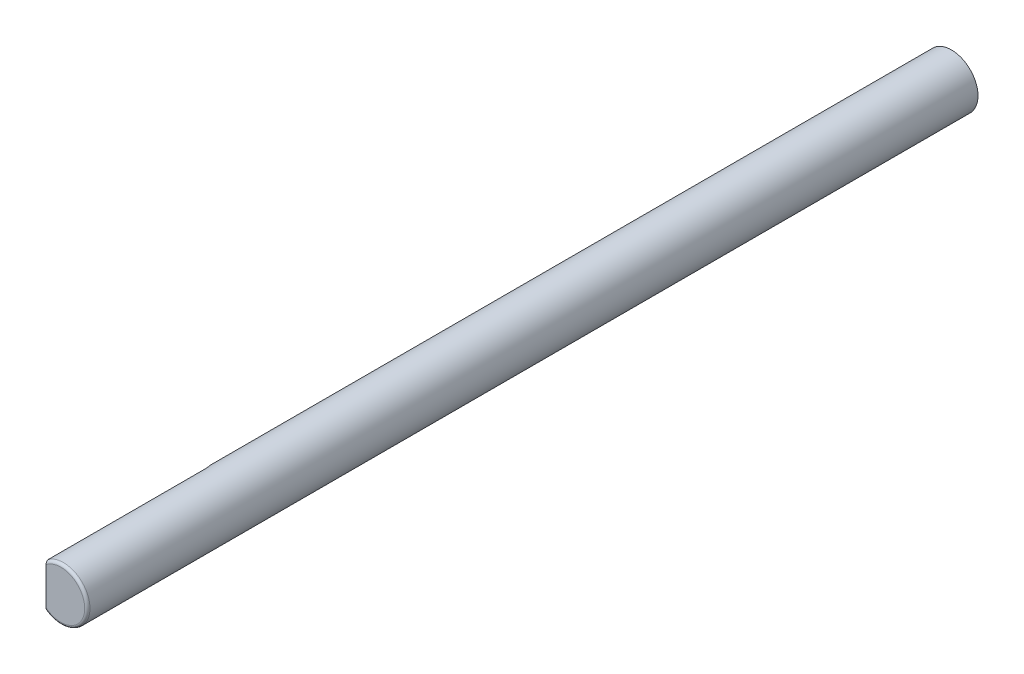
ISO-10303-21;
HEADER;
FILE_DESCRIPTION(('STEP AP214'),'2;1');
FILE_NAME('part.step','',(''),(''),'','','');
FILE_SCHEMA(('AUTOMOTIVE_DESIGN { 1 0 10303 214 1 1 1 1 }'));
ENDSEC;
DATA;
#1=APPLICATION_CONTEXT('core data for automotive mechanical design processes');
#2=APPLICATION_PROTOCOL_DEFINITION('international standard','automotive_design',2000,#1);
#3=PRODUCT_CONTEXT('',#1,'mechanical');
#4=PRODUCT('Part','Part','',(#3));
#5=PRODUCT_RELATED_PRODUCT_CATEGORY('part','',(#4));
#6=PRODUCT_DEFINITION_FORMATION('','',#4);
#7=PRODUCT_DEFINITION_CONTEXT('part definition',#1,'design');
#8=PRODUCT_DEFINITION('design','',#6,#7);
#9=PRODUCT_DEFINITION_SHAPE('','',#8);
#10=(LENGTH_UNIT() NAMED_UNIT(*) SI_UNIT(.MILLI.,.METRE.));
#11=(NAMED_UNIT(*) PLANE_ANGLE_UNIT() SI_UNIT($,.RADIAN.));
#12=(NAMED_UNIT(*) SI_UNIT($,.STERADIAN.) SOLID_ANGLE_UNIT());
#13=UNCERTAINTY_MEASURE_WITH_UNIT(LENGTH_MEASURE(1.E-05),#10,'distance_accuracy_value','');
#14=(GEOMETRIC_REPRESENTATION_CONTEXT(3) GLOBAL_UNCERTAINTY_ASSIGNED_CONTEXT((#13)) GLOBAL_UNIT_ASSIGNED_CONTEXT((#10,
#11,#12)) REPRESENTATION_CONTEXT('',''));
#15=CARTESIAN_POINT('',(0.,0.,0.));
#16=DIRECTION('',(0.,0.,1.));
#17=DIRECTION('',(1.,0.,0.));
#18=AXIS2_PLACEMENT_3D('',#15,#16,#17);
#19=CARTESIAN_POINT('',(0.,0.,84.));
#20=DIRECTION('',(0.,0.,-1.));
#21=DIRECTION('',(-1.,0.,0.));
#22=AXIS2_PLACEMENT_3D('',#19,#20,#21);
#23=CYLINDRICAL_SURFACE('',#22,2.5);
#24=CARTESIAN_POINT('',(0.,0.,0.));
#25=DIRECTION('',(0.,0.,1.));
#26=DIRECTION('',(1.,0.,0.));
#27=AXIS2_PLACEMENT_3D('',#24,#25,#26);
#28=CIRCLE('',#27,2.5);
#29=CARTESIAN_POINT('',(2.5,0.,0.));
#30=VERTEX_POINT('',#29);
#31=EDGE_CURVE('E83',#30,#30,#28,.T.);
#32=ORIENTED_EDGE('',*,*,#31,.T.);
#33=EDGE_LOOP('',(#32));
#34=FACE_BOUND('',#33,.T.);
#35=DIRECTION('',(0.,0.,-1.));
#36=VECTOR('',#35,1.);
#37=CARTESIAN_POINT('',(-1.4,2.0712315177208,84.));
#38=LINE('',#37,#36);
#39=CARTESIAN_POINT('',(-1.4,2.07123151772333,83.750000000001));
#40=VERTEX_POINT('',#39);
#41=CARTESIAN_POINT('',(-1.4,2.0712315177208,69.));
#42=VERTEX_POINT('',#41);
#43=EDGE_CURVE('E79',#40,#42,#38,.T.);
#44=ORIENTED_EDGE('',*,*,#43,.F.);
#45=CARTESIAN_POINT('',(0.,0.,83.75));
#46=DIRECTION('',(0.,0.,1.));
#47=DIRECTION('',(1.,0.,0.));
#48=AXIS2_PLACEMENT_3D('',#45,#46,#47);
#49=CIRCLE('',#48,2.5);
#50=CARTESIAN_POINT('',(-1.4,-2.07123151776407,83.7499999999845));
#51=VERTEX_POINT('',#50);
#52=EDGE_CURVE('E82',#40,#51,#49,.F.);
#53=ORIENTED_EDGE('',*,*,#52,.T.);
#54=DIRECTION('',(0.,0.,-1.));
#55=VECTOR('',#54,1.);
#56=CARTESIAN_POINT('',(-1.4,-2.0712315177208,84.));
#57=LINE('',#56,#55);
#58=CARTESIAN_POINT('',(-1.4,-2.0712315177208,69.));
#59=VERTEX_POINT('',#58);
#60=EDGE_CURVE('E59',#59,#51,#57,.F.);
#61=ORIENTED_EDGE('',*,*,#60,.F.);
#62=CARTESIAN_POINT('',(-1.4,2.0712315177208,69.));
#63=CARTESIAN_POINT('',(-1.39999849760734,2.071230026212,68.9761336321505));
#64=CARTESIAN_POINT('',(-1.4008551488557,2.07065376805564,68.9522791906795));
#65=CARTESIAN_POINT('',(-1.40426145306465,2.06834621400237,68.9047514836602));
#66=CARTESIAN_POINT('',(-1.40681083767712,2.06661510118376,68.8810781899963));
#67=CARTESIAN_POINT('',(-1.41693911021825,2.059697650857,68.8107243778241));
#68=CARTESIAN_POINT('',(-1.42699848417546,2.052787241238,68.7645353429884));
#69=CARTESIAN_POINT('',(-1.45316462908092,2.03434628246119,68.6749057138266));
#70=CARTESIAN_POINT('',(-1.46927177576743,2.02281544624079,68.6314652904634));
#71=CARTESIAN_POINT('',(-1.50660792862268,1.99516165480954,68.5484218227556));
#72=CARTESIAN_POINT('',(-1.52783743401127,1.97903825198415,68.5088191529622));
#73=CARTESIAN_POINT('',(-1.57474464069025,1.94192906346373,68.4334600120503));
#74=CARTESIAN_POINT('',(-1.60051004822206,1.92084396604997,68.3978075175362));
#75=CARTESIAN_POINT('',(-1.65476045746045,1.8743126759908,68.3318339530109));
#76=CARTESIAN_POINT('',(-1.68324681285336,1.84886430753644,68.3015155582839));
#77=CARTESIAN_POINT('',(-1.75188020240658,1.78432861963461,68.2365263708325));
#78=CARTESIAN_POINT('',(-1.79259801470348,1.74359569054774,68.2040886147845));
#79=CARTESIAN_POINT('',(-1.87373293961664,1.6561127393503,68.1482480300484));
#80=CARTESIAN_POINT('',(-1.9141494387131,1.60935281202574,68.1248603339338));
#81=CARTESIAN_POINT('',(-2.00868395747665,1.49097224184157,68.0776682724385));
#82=CARTESIAN_POINT('',(-2.06167245566697,1.41698665412497,68.0575792205504));
#83=CARTESIAN_POINT('',(-2.15998693685785,1.26211622920362,68.0278654267815));
#84=CARTESIAN_POINT('',(-2.20529362558644,1.18121476547613,68.0182667137365));
#85=CARTESIAN_POINT('',(-2.27518682931121,1.03824044791976,68.0073850582776));
#86=CARTESIAN_POINT('',(-2.3020034371994,0.977346431713889,68.0045145279523));
#87=CARTESIAN_POINT('',(-2.35072392208405,0.853535355661817,68.0009151495136));
#88=CARTESIAN_POINT('',(-2.37262582697523,0.790617495251964,68.0001871597154));
#89=CARTESIAN_POINT('',(-2.41133776392088,0.663236816952994,67.9998771329302));
#90=CARTESIAN_POINT('',(-2.42814758959221,0.598773936558105,68.0002951423839));
#91=CARTESIAN_POINT('',(-2.45656795841086,0.468725016715089,68.0014998441395));
#92=CARTESIAN_POINT('',(-2.46817917835835,0.403139124625449,68.0022864884219));
#93=CARTESIAN_POINT('',(-2.48629500567455,0.270052532778325,68.0036879932044));
#94=CARTESIAN_POINT('',(-2.49270333079678,0.202538665641398,68.0042994849443));
#95=CARTESIAN_POINT('',(-2.50001501608926,0.0672084542153271,68.0050072591245));
#96=CARTESIAN_POINT('',(-2.50091820098299,-0.000607899635807625,68.0051035251607));
#97=CARTESIAN_POINT('',(-2.49721126667906,-0.136146726712124,68.0047344925744));
#98=CARTESIAN_POINT('',(-2.4925963955963,-0.203869068669605,68.0042687099395));
#99=CARTESIAN_POINT('',(-2.47787728559477,-0.338709390708672,68.003009853324));
#100=CARTESIAN_POINT('',(-2.46777310584157,-0.405827377296271,68.0022167828711));
#101=CARTESIAN_POINT('',(-2.44166968941243,-0.541472802830017,68.0007798339144));
#102=CARTESIAN_POINT('',(-2.42546739083533,-0.60996134772772,68.000142511919));
#103=CARTESIAN_POINT('',(-2.38734056394478,-0.745353962722344,67.9998984993942));
#104=CARTESIAN_POINT('',(-2.36541438705108,-0.812257570263473,68.0002921060865));
#105=CARTESIAN_POINT('',(-2.31606035856292,-0.943815957062461,68.0032230416401));
#106=CARTESIAN_POINT('',(-2.288643687182,-1.00847499794695,68.0057560472638));
#107=CARTESIAN_POINT('',(-2.22858646003884,-1.13503422834247,68.0143345571866));
#108=CARTESIAN_POINT('',(-2.1959502673537,-1.19693666736589,68.0203771387835));
#109=CARTESIAN_POINT('',(-2.122180192478,-1.32373849224061,68.0385362468503));
#110=CARTESIAN_POINT('',(-2.08051081784006,-1.38825056412551,68.051233161495));
#111=CARTESIAN_POINT('',(-1.99267532777598,-1.51160369346607,68.0855058136959));
#112=CARTESIAN_POINT('',(-1.94651692208629,-1.57045414037393,68.1070665266445));
#113=CARTESIAN_POINT('',(-1.86164401332915,-1.66962592428561,68.1561611961749));
#114=CARTESIAN_POINT('',(-1.82330783215961,-1.71128948965173,68.181610704844));
#115=CARTESIAN_POINT('',(-1.74725608089454,-1.7888638451824,68.2408954194401));
#116=CARTESIAN_POINT('',(-1.70953987270419,-1.82478093209195,68.2747213418162));
#117=CARTESIAN_POINT('',(-1.64313851742848,-1.88461329310625,68.3449408068652));
#118=CARTESIAN_POINT('',(-1.61398037683588,-1.90953027717283,68.3800297594055));
#119=CARTESIAN_POINT('',(-1.55957119801497,-1.95422054334929,68.4560692469223));
#120=CARTESIAN_POINT('',(-1.5343194425111,-1.97399477020797,68.4970187031507));
#121=CARTESIAN_POINT('',(-1.48925213542689,-2.00821755195405,68.5841221584053));
#122=CARTESIAN_POINT('',(-1.46946172497382,-2.02264157874109,68.6302988910753));
#123=CARTESIAN_POINT('',(-1.4368361713967,-2.04594939702088,68.7263564470342));
#124=CARTESIAN_POINT('',(-1.42399490317059,-2.05483806852325,68.7762339641375));
#125=CARTESIAN_POINT('',(-1.41007156402516,-2.06439648102776,68.85550440898));
#126=CARTESIAN_POINT('',(-1.40630111414533,-2.06696205385486,68.8842332109407));
#127=CARTESIAN_POINT('',(-1.40126460084139,-2.0703770393523,68.9419691555056));
#128=CARTESIAN_POINT('',(-1.39999499231638,-2.07122888138113,68.970975845446));
#129=CARTESIAN_POINT('',(-1.4,-2.0712315177208,69.));
#130=B_SPLINE_CURVE_WITH_KNOTS('',3,(#62,#63,#64,#65,#66,#67,#68,#69,#70,#71,#72,#73,#74,#75,
#76,#77,#78,#79,#80,#81,#82,#83,#84,#85,#86,#87,#88,#89,#90,#91,#92,#93,#94,#95,#96,#97,#98,#99,
#100,#101,#102,#103,#104,#105,#106,#107,#108,#109,#110,#111,#112,#113,#114,#115,#116,#117,#118,
#119,#120,#121,#122,#123,#124,#125,#126,#127,#128,#129),.UNSPECIFIED.,.F.,.F.,(4,2,2,2,2,2,2,2,
2,2,2,2,2,2,2,2,2,2,2,2,2,2,2,2,2,2,2,2,2,2,2,2,2,4),(0.,0.0715532695161541,0.143095198438097,
0.285662258223495,0.428238176934256,0.570827996565418,0.716559703502123,0.862364294176869,
1.05956506247234,1.25709415914808,1.53513154445077,1.81385724627248,2.01341483696891,
2.21305236080002,2.4126979749028,2.61231758982238,2.81555207530805,3.01879303148235,
3.22220913514272,3.42562304636159,3.63651498052538,3.8474677225155,4.05799519420229,
4.26834759385541,4.50119263591326,4.73364461005269,4.91917153753062,5.10449375925448,
5.25978134170542,5.41504037691089,5.57100265153674,5.72682723330396,5.8139490850776,
5.90094734697915),.UNSPECIFIED.);
#131=EDGE_CURVE('E11',#42,#59,#130,.T.);
#132=ORIENTED_EDGE('',*,*,#131,.F.);
#133=EDGE_LOOP('',(#44,#53,#61,#132));
#134=FACE_BOUND('',#133,.T.);
#135=ADVANCED_FACE('F32',(#34,#134),#23,.T.);
#136=CARTESIAN_POINT('',(0.,0.,84.));
#137=DIRECTION('',(0.,0.,1.));
#138=DIRECTION('',(1.,0.,0.));
#139=AXIS2_PLACEMENT_3D('',#136,#137,#138);
#140=PLANE('',#139);
#141=CARTESIAN_POINT('',(0.,0.,84.));
#142=DIRECTION('',(0.,0.,1.));
#143=DIRECTION('',(1.,0.,0.));
#144=AXIS2_PLACEMENT_3D('',#141,#142,#143);
#145=CIRCLE('',#144,2.25);
#146=CARTESIAN_POINT('',(-1.4,-1.76139149538085,84.));
#147=VERTEX_POINT('',#146);
#148=CARTESIAN_POINT('',(-1.4,1.76139149538085,84.));
#149=VERTEX_POINT('',#148);
#150=EDGE_CURVE('E78',#147,#149,#145,.T.);
#151=ORIENTED_EDGE('',*,*,#150,.T.);
#152=DIRECTION('',(0.,-1.,0.));
#153=VECTOR('',#152,1.);
#154=CARTESIAN_POINT('',(-1.4,3.,84.));
#155=LINE('',#154,#153);
#156=EDGE_CURVE('E53',#149,#147,#155,.T.);
#157=ORIENTED_EDGE('',*,*,#156,.T.);
#158=EDGE_LOOP('',(#151,#157));
#159=FACE_BOUND('',#158,.T.);
#160=ADVANCED_FACE('F77',(#159),#140,.T.);
#161=CARTESIAN_POINT('',(0.,0.,83.75));
#162=DIRECTION('',(0.,0.,1.));
#163=DIRECTION('',(1.,0.,0.));
#164=AXIS2_PLACEMENT_3D('',#161,#162,#163);
#165=TOROIDAL_SURFACE('',#164,2.25,0.25);
#166=ORIENTED_EDGE('',*,*,#150,.F.);
#167=CARTESIAN_POINT('',(-1.4,-2.06751683308907,83.7891010855561));
#168=CARTESIAN_POINT('',(-1.4,-2.069746634839,83.777437227729));
#169=CARTESIAN_POINT('',(-1.4,-2.07098619314722,83.7655748201244));
#170=CARTESIAN_POINT('',(-1.4,-2.07141107098376,83.7418068058583));
#171=CARTESIAN_POINT('',(-1.4,-2.07059465921011,83.7299011712248));
#172=CARTESIAN_POINT('',(-1.4,-2.0669532950407,83.7064217157143));
#173=CARTESIAN_POINT('',(-1.4,-2.06413145538077,83.6948474094905));
#174=CARTESIAN_POINT('',(-1.4,-2.05662810914329,83.6723235623698));
#175=CARTESIAN_POINT('',(-1.4,-2.05194655243664,83.6613740383231));
#176=CARTESIAN_POINT('',(-1.4,-2.04080930293354,83.6400952407117));
#177=CARTESIAN_POINT('',(-1.4,-2.03431462231285,83.6297865031043));
#178=CARTESIAN_POINT('',(-1.4,-2.01986653934909,83.6102529605718));
#179=CARTESIAN_POINT('',(-1.4,-2.01191266429024,83.6010285085018));
#180=CARTESIAN_POINT('',(-1.4,-1.99375410344371,83.5827007751038));
#181=CARTESIAN_POINT('',(-1.4,-1.98339275579103,83.5737531623327));
#182=CARTESIAN_POINT('',(-1.4,-1.9615096579369,83.5574182538762));
#183=CARTESIAN_POINT('',(-1.4,-1.94998725736353,83.5500318399631));
#184=CARTESIAN_POINT('',(-1.4,-1.92398558481914,83.535664766199));
#185=CARTESIAN_POINT('',(-1.4,-1.90934196489994,83.5289819633223));
#186=CARTESIAN_POINT('',(-1.4,-1.87927037468485,83.5177232068365));
#187=CARTESIAN_POINT('',(-1.4,-1.86384195411896,83.5131484782001));
#188=CARTESIAN_POINT('',(-1.4,-1.8295083338728,83.50534262039));
#189=CARTESIAN_POINT('',(-1.4,-1.81050556367343,83.5025396438597));
#190=CARTESIAN_POINT('',(-1.4,-1.77229105082405,83.4996869685397));
#191=CARTESIAN_POINT('',(-1.4,-1.75307914527016,83.4996395965652));
#192=CARTESIAN_POINT('',(-1.4,-1.7117902214243,83.5024012227717));
#193=CARTESIAN_POINT('',(-1.4,-1.6897427077554,83.5056650155171));
#194=CARTESIAN_POINT('',(-1.4,-1.64644198331438,83.5156791685163));
#195=CARTESIAN_POINT('',(-1.4,-1.62518892017161,83.522430173364));
#196=CARTESIAN_POINT('',(-1.4,-1.58737690923002,83.5380971283731));
#197=CARTESIAN_POINT('',(-1.4,-1.5706065627723,83.5465031021878));
#198=CARTESIAN_POINT('',(-1.4,-1.53861329491592,83.5658770933205));
#199=CARTESIAN_POINT('',(-1.4,-1.52338802602704,83.57684113784));
#200=CARTESIAN_POINT('',(-1.4,-1.49897049299346,83.5981346111587));
#201=CARTESIAN_POINT('',(-1.4,-1.48925035998302,83.6078580040598));
#202=CARTESIAN_POINT('',(-1.4,-1.4714584706523,83.6287166431668));
#203=CARTESIAN_POINT('',(-1.4,-1.46338439491052,83.6398498664211));
#204=CARTESIAN_POINT('',(-1.4,-1.4507334316404,83.6611586976973));
#205=CARTESIAN_POINT('',(-1.4,-1.44578318431218,83.6711114792114));
#206=CARTESIAN_POINT('',(-1.4,-1.43759584646563,83.6917020970444));
#207=CARTESIAN_POINT('',(-1.4,-1.43435746539131,83.7023394104964));
#208=CARTESIAN_POINT('',(-1.4,-1.4298290781451,83.7240925513703));
#209=CARTESIAN_POINT('',(-1.4,-1.42855045587284,83.7352107917521));
#210=CARTESIAN_POINT('',(-1.4,-1.42809553098984,83.7574896787589));
#211=CARTESIAN_POINT('',(-1.4,-1.42891878834498,83.7686503160196));
#212=CARTESIAN_POINT('',(-1.4,-1.43241916211485,83.7896145408629));
#213=CARTESIAN_POINT('',(-1.4,-1.43491906611748,83.7994486210256));
#214=CARTESIAN_POINT('',(-1.4,-1.44141428492636,83.8186058830384));
#215=CARTESIAN_POINT('',(-1.4,-1.44541017890801,83.8279288654112));
#216=CARTESIAN_POINT('',(-1.4,-1.45621885548422,83.8488975046023));
#217=CARTESIAN_POINT('',(-1.4,-1.46352634537145,83.8602879919474));
#218=CARTESIAN_POINT('',(-1.4,-1.47989400527921,83.8817327842286));
#219=CARTESIAN_POINT('',(-1.4,-1.48895766474658,83.8917843605605));
#220=CARTESIAN_POINT('',(-1.4,-1.51172684638418,83.9137057431346));
#221=CARTESIAN_POINT('',(-1.4,-1.5259608406107,83.9250252168777));
#222=CARTESIAN_POINT('',(-1.4,-1.55604364818145,83.9452346300285));
#223=CARTESIAN_POINT('',(-1.4,-1.57189399103952,83.9541222383772));
#224=CARTESIAN_POINT('',(-1.4,-1.60509205177314,83.9697301689048));
#225=CARTESIAN_POINT('',(-1.4,-1.62246678945901,83.9763926027679));
#226=CARTESIAN_POINT('',(-1.4,-1.65795648623811,83.9872847058436));
#227=CARTESIAN_POINT('',(-1.4,-1.67607156097389,83.9915139934249));
#228=CARTESIAN_POINT('',(-1.4,-1.71668463073393,83.9981790966882));
#229=CARTESIAN_POINT('',(-1.4,-1.73928135435024,84.0000272604717));
#230=CARTESIAN_POINT('',(-1.4,-1.78448376970429,83.9999721482763));
#231=CARTESIAN_POINT('',(-1.4,-1.80708946223592,83.998068372268));
#232=CARTESIAN_POINT('',(-1.4,-1.84821950148282,83.9909004794561));
#233=CARTESIAN_POINT('',(-1.4,-1.86684068119384,83.9861928771535));
#234=CARTESIAN_POINT('',(-1.4,-1.9030649201353,83.97380006518));
#235=CARTESIAN_POINT('',(-1.4,-1.92066925601976,83.9661186867871));
#236=CARTESIAN_POINT('',(-1.4,-1.95108276070406,83.9494011757541));
#237=CARTESIAN_POINT('',(-1.4,-1.96417540630333,83.9408812900778));
#238=CARTESIAN_POINT('',(-1.4,-1.98879972897975,83.9218099295069));
#239=CARTESIAN_POINT('',(-1.4,-2.00033247871238,83.9112598628762));
#240=CARTESIAN_POINT('',(-1.4,-2.01971362853195,83.889999748638));
#241=CARTESIAN_POINT('',(-1.4,-2.02785558157892,83.8795574753407));
#242=CARTESIAN_POINT('',(-1.4,-2.0422844443968,83.8574712871667));
#243=CARTESIAN_POINT('',(-1.4,-2.0485750115816,83.8458298036274));
#244=CARTESIAN_POINT('',(-1.4,-2.05686313303344,83.8265667315097));
#245=CARTESIAN_POINT('',(-1.4,-2.05956520863061,83.8192420974961));
#246=CARTESIAN_POINT('',(-1.4,-2.06415970755473,83.8043406035764));
#247=CARTESIAN_POINT('',(-1.4,-2.0660519584504,83.7967636903237));
#248=CARTESIAN_POINT('',(-1.4,-2.06751683308907,83.7891010855561));
#249=B_SPLINE_CURVE_WITH_KNOTS('',3,(#167,#168,#169,#170,#171,#172,#173,#174,#175,#176,#177,
#178,#179,#180,#181,#182,#183,#184,#185,#186,#187,#188,#189,#190,#191,#192,#193,#194,#195,#196,
#197,#198,#199,#200,#201,#202,#203,#204,#205,#206,#207,#208,#209,#210,#211,#212,#213,#214,#215,
#216,#217,#218,#219,#220,#221,#222,#223,#224,#225,#226,#227,#228,#229,#230,#231,#232,#233,#234,
#235,#236,#237,#238,#239,#240,#241,#242,#243,#244,#245,#246,#247,#248),.UNSPECIFIED.,.T.,.F.,(4,
2,2,2,2,2,2,2,2,2,2,2,2,2,2,2,2,2,2,2,2,2,2,2,2,2,2,2,2,2,2,2,2,2,2,2,2,2,2,2,4),(0.,
0.0355961807103666,0.0712223464591754,0.106793335293137,0.142365283016352,0.178770448703528,
0.215187428979944,0.25610206295447,0.297039744316006,0.345150289814794,0.3932887565397,
0.450693683664042,0.508147082446437,0.574724248706866,0.641313725831197,0.697391627920774,
0.753383011517212,0.794490689246696,0.835540036524231,0.868754193931726,0.901943275733754,
0.935324426140196,0.968698588686469,0.999007499009386,1.02932815563994,1.06970492159056,
1.1101627530615,1.1644290795813,1.21874724217936,1.27438481822111,1.33003111846335,
1.39774216865078,1.46546224345021,1.5228586526092,1.58018135961872,1.62686222808656,
1.67351083167204,1.71307288751941,1.75255625566707,1.77593629271711,1.79932130546876),.UNSPECIFIED.);
#250=EDGE_CURVE('E46',#147,#51,#249,.T.);
#251=ORIENTED_EDGE('',*,*,#250,.T.);
#252=ORIENTED_EDGE('',*,*,#52,.F.);
#253=CARTESIAN_POINT('',(-1.4,1.42993276071515,83.7742261251651));
#254=CARTESIAN_POINT('',(-1.4,1.4284797737069,83.7635492828198));
#255=CARTESIAN_POINT('',(-1.4,1.42798224116026,83.7527308891549));
#256=CARTESIAN_POINT('',(-1.4,1.42895217107646,83.7311692769835));
#257=CARTESIAN_POINT('',(-1.4,1.43042317296387,83.7204262288915));
#258=CARTESIAN_POINT('',(-1.4,1.4351972866723,83.6994144021854));
#259=CARTESIAN_POINT('',(-1.4,1.43849176524819,83.6891436338747));
#260=CARTESIAN_POINT('',(-1.4,1.44666971777003,83.6692642515512));
#261=CARTESIAN_POINT('',(-1.4,1.45155370771529,83.6596558537912));
#262=CARTESIAN_POINT('',(-1.4,1.46444756291549,83.6382390395022));
#263=CARTESIAN_POINT('',(-1.4,1.47295744431321,83.6267322484986));
#264=CARTESIAN_POINT('',(-1.4,1.49172277952782,83.6052419199731));
#265=CARTESIAN_POINT('',(-1.4,1.50198172658523,83.5952615081257));
#266=CARTESIAN_POINT('',(-1.4,1.52752231017559,83.57368243797));
#267=CARTESIAN_POINT('',(-1.4,1.54332172700824,83.5626978240926));
#268=CARTESIAN_POINT('',(-1.4,1.5764636907251,83.543410721086));
#269=CARTESIAN_POINT('',(-1.4,1.59380751652582,83.5351104817155));
#270=CARTESIAN_POINT('',(-1.4,1.62990007353499,83.5209669260947));
#271=CARTESIAN_POINT('',(-1.4,1.64867116870904,83.5151810264129));
#272=CARTESIAN_POINT('',(-1.4,1.68684132045745,83.5063189232525));
#273=CARTESIAN_POINT('',(-1.4,1.70624056049469,83.5032435189686));
#274=CARTESIAN_POINT('',(-1.4,1.74873438637281,83.4995536950047));
#275=CARTESIAN_POINT('',(-1.4,1.77187720679287,83.4994690666402));
#276=CARTESIAN_POINT('',(-1.4,1.81784027375452,83.5033042850002));
#277=CARTESIAN_POINT('',(-1.4,1.8406606502949,83.5072224683454));
#278=CARTESIAN_POINT('',(-1.4,1.88030824440977,83.5179758414874));
#279=CARTESIAN_POINT('',(-1.4,1.89735869050309,83.5239903626366));
#280=CARTESIAN_POINT('',(-1.4,1.93025269881234,83.5387117960323));
#281=CARTESIAN_POINT('',(-1.4,1.94609799374123,83.5474147481545));
#282=CARTESIAN_POINT('',(-1.4,1.97329805283162,83.5657532706061));
#283=CARTESIAN_POINT('',(-1.4,1.98495007952569,83.5749470568571));
#284=CARTESIAN_POINT('',(-1.4,2.00659791928445,83.5951300283886));
#285=CARTESIAN_POINT('',(-1.4,2.0165939919253,83.6061189317414));
#286=CARTESIAN_POINT('',(-1.4,2.03452337916375,83.6298236204109));
#287=CARTESIAN_POINT('',(-1.4,2.04243949530355,83.64255255701));
#288=CARTESIAN_POINT('',(-1.4,2.05560314677402,83.6693255902568));
#289=CARTESIAN_POINT('',(-1.4,2.06085347256681,83.6833682933797));
#290=CARTESIAN_POINT('',(-1.4,2.06777488493682,83.7101941879195));
#291=CARTESIAN_POINT('',(-1.4,2.06984728297949,83.7228744694489));
#292=CARTESIAN_POINT('',(-1.4,2.07161875211616,83.7483975931196));
#293=CARTESIAN_POINT('',(-1.4,2.07131914533059,83.7612403407195));
#294=CARTESIAN_POINT('',(-1.4,2.06849276478409,83.7855836680409));
#295=CARTESIAN_POINT('',(-1.4,2.06615414494295,83.7971067418847));
#296=CARTESIAN_POINT('',(-1.4,2.05962450786555,83.8196121664178));
#297=CARTESIAN_POINT('',(-1.4,2.05543347758694,83.8305945132994));
#298=CARTESIAN_POINT('',(-1.4,2.04525546888173,83.8520540796839));
#299=CARTESIAN_POINT('',(-1.4,2.03922285619763,83.8625095152223));
#300=CARTESIAN_POINT('',(-1.4,2.02565875048043,83.8823937703506));
#301=CARTESIAN_POINT('',(-1.4,2.01812673296544,83.8918222289203));
#302=CARTESIAN_POINT('',(-1.4,2.00089325345193,83.9105442717815));
#303=CARTESIAN_POINT('',(-1.4,1.99104234333875,83.9196998594455));
#304=CARTESIAN_POINT('',(-1.4,1.97014066575348,83.9365135536256));
#305=CARTESIAN_POINT('',(-1.4,1.95908926581927,83.9441708647857));
#306=CARTESIAN_POINT('',(-1.4,1.93412074607394,83.9591496788247));
#307=CARTESIAN_POINT('',(-1.4,1.92003619338563,83.9661916355393));
#308=CARTESIAN_POINT('',(-1.4,1.89102703340342,83.9782429473955));
#309=CARTESIAN_POINT('',(-1.4,1.87610193650406,83.9832511036365));
#310=CARTESIAN_POINT('',(-1.4,1.84280444408958,83.9920802029752));
#311=CARTESIAN_POINT('',(-1.4,1.82432193698389,83.9954864482576));
#312=CARTESIAN_POINT('',(-1.4,1.78705897675404,83.999632953357));
#313=CARTESIAN_POINT('',(-1.4,1.76827830406451,84.0003711473871));
#314=CARTESIAN_POINT('',(-1.4,1.72766042914336,83.9991943088168));
#315=CARTESIAN_POINT('',(-1.4,1.7058358179539,83.9968162703746));
#316=CARTESIAN_POINT('',(-1.4,1.66281719964284,83.9886666111979));
#317=CARTESIAN_POINT('',(-1.4,1.64162346661543,83.982893537413));
#318=CARTESIAN_POINT('',(-1.4,1.60269978366878,83.9687692719744));
#319=CARTESIAN_POINT('',(-1.4,1.58484363630791,83.9607661895332));
#320=CARTESIAN_POINT('',(-1.4,1.55064348794347,83.9419985160101));
#321=CARTESIAN_POINT('',(-1.4,1.53429726285779,83.9312380776336));
#322=CARTESIAN_POINT('',(-1.4,1.50800360075093,83.9101738541302));
#323=CARTESIAN_POINT('',(-1.4,1.49752252074504,83.9005364541875));
#324=CARTESIAN_POINT('',(-1.4,1.4781900088246,83.8797316327081));
#325=CARTESIAN_POINT('',(-1.4,1.46933696054252,83.8685657481343));
#326=CARTESIAN_POINT('',(-1.4,1.4553866398127,83.8472169267859));
#327=CARTESIAN_POINT('',(-1.4,1.44989176924671,83.8372946061366));
#328=CARTESIAN_POINT('',(-1.4,1.440613669983,83.8166963128793));
#329=CARTESIAN_POINT('',(-1.4,1.43682518104739,83.8060227753251));
#330=CARTESIAN_POINT('',(-1.4,1.43226142431139,83.7882300777324));
#331=CARTESIAN_POINT('',(-1.4,1.43088982249655,83.7812588086625));
#332=CARTESIAN_POINT('',(-1.4,1.42993276071515,83.7742261251651));
#333=B_SPLINE_CURVE_WITH_KNOTS('',3,(#253,#254,#255,#256,#257,#258,#259,#260,#261,#262,#263,
#264,#265,#266,#267,#268,#269,#270,#271,#272,#273,#274,#275,#276,#277,#278,#279,#280,#281,#282,
#283,#284,#285,#286,#287,#288,#289,#290,#291,#292,#293,#294,#295,#296,#297,#298,#299,#300,#301,
#302,#303,#304,#305,#306,#307,#308,#309,#310,#311,#312,#313,#314,#315,#316,#317,#318,#319,#320,
#321,#322,#323,#324,#325,#326,#327,#328,#329,#330,#331,#332),.UNSPECIFIED.,.T.,.F.,(4,2,2,2,2,2,
2,2,2,2,2,2,2,2,2,2,2,2,2,2,2,2,2,2,2,2,2,2,2,2,2,2,2,2,2,2,2,2,2,4),(0.,0.0322996316278615,
0.0646574160847306,0.096863297156863,0.129079643593708,0.171780181848062,0.214567022800619,
0.271988079145316,0.329457135780382,0.388177203968,0.44691458009216,0.51601283843205,
0.585082394481332,0.639116393508079,0.693071175643631,0.737421555445708,0.78176497659083,
0.826464275056178,0.871116686793241,0.909451369851453,0.947764687228999,0.982877218288066,
1.01798999656931,1.05405527119197,1.09013318344645,1.1303253784221,1.17053885177042,
1.21760450329616,1.26469785931709,1.32086538781994,1.37707639573943,1.44266164389499,
1.50827498250886,1.5667620583001,1.62516156230648,1.66773609512107,1.71026812749146,
1.74416592260336,1.77795849403699,1.79923379987858),.UNSPECIFIED.);
#334=EDGE_CURVE('E74',#40,#149,#333,.T.);
#335=ORIENTED_EDGE('',*,*,#334,.T.);
#336=EDGE_LOOP('',(#166,#251,#252,#335));
#337=FACE_BOUND('',#336,.T.);
#338=ADVANCED_FACE('F34',(#337),#165,.T.);
#339=CARTESIAN_POINT('',(0.,0.,0.));
#340=DIRECTION('',(0.,0.,1.));
#341=DIRECTION('',(1.,0.,0.));
#342=AXIS2_PLACEMENT_3D('',#339,#340,#341);
#343=PLANE('',#342);
#344=ORIENTED_EDGE('',*,*,#31,.F.);
#345=EDGE_LOOP('',(#344));
#346=FACE_BOUND('',#345,.T.);
#347=ADVANCED_FACE('F105',(#346),#343,.F.);
#348=CARTESIAN_POINT('',(-2.4,3.,69.));
#349=DIRECTION('',(0.,-1.,0.));
#350=DIRECTION('',(0.,0.,-1.));
#351=AXIS2_PLACEMENT_3D('',#348,#349,#350);
#352=CYLINDRICAL_SURFACE('',#351,1.);
#353=ORIENTED_EDGE('',*,*,#131,.T.);
#354=DIRECTION('',(0.,-1.,0.));
#355=VECTOR('',#354,1.);
#356=CARTESIAN_POINT('',(-1.4,3.,69.));
#357=LINE('',#356,#355);
#358=EDGE_CURVE('E80',#42,#59,#357,.T.);
#359=ORIENTED_EDGE('',*,*,#358,.F.);
#360=EDGE_LOOP('',(#353,#359));
#361=FACE_BOUND('',#360,.T.);
#362=ADVANCED_FACE('F100',(#361),#352,.F.);
#363=CARTESIAN_POINT('',(-1.4,3.,84.));
#364=DIRECTION('',(-1.,0.,0.));
#365=DIRECTION('',(0.,0.,1.));
#366=AXIS2_PLACEMENT_3D('',#363,#364,#365);
#367=PLANE('',#366);
#368=ORIENTED_EDGE('',*,*,#60,.T.);
#369=ORIENTED_EDGE('',*,*,#250,.F.);
#370=ORIENTED_EDGE('',*,*,#156,.F.);
#371=ORIENTED_EDGE('',*,*,#334,.F.);
#372=ORIENTED_EDGE('',*,*,#43,.T.);
#373=ORIENTED_EDGE('',*,*,#358,.T.);
#374=EDGE_LOOP('',(#368,#369,#370,#371,#372,#373));
#375=FACE_BOUND('',#374,.T.);
#376=ADVANCED_FACE('F69',(#375),#367,.T.);
#377=CLOSED_SHELL('',(#135,#160,#338,#347,#362,#376));
#378=MANIFOLD_SOLID_BREP('B2',#377);
#379=ADVANCED_BREP_SHAPE_REPRESENTATION('',(#18,#378),#14);
#380=SHAPE_DEFINITION_REPRESENTATION(#9,#379);
ENDSEC;
END-ISO-10303-21;
